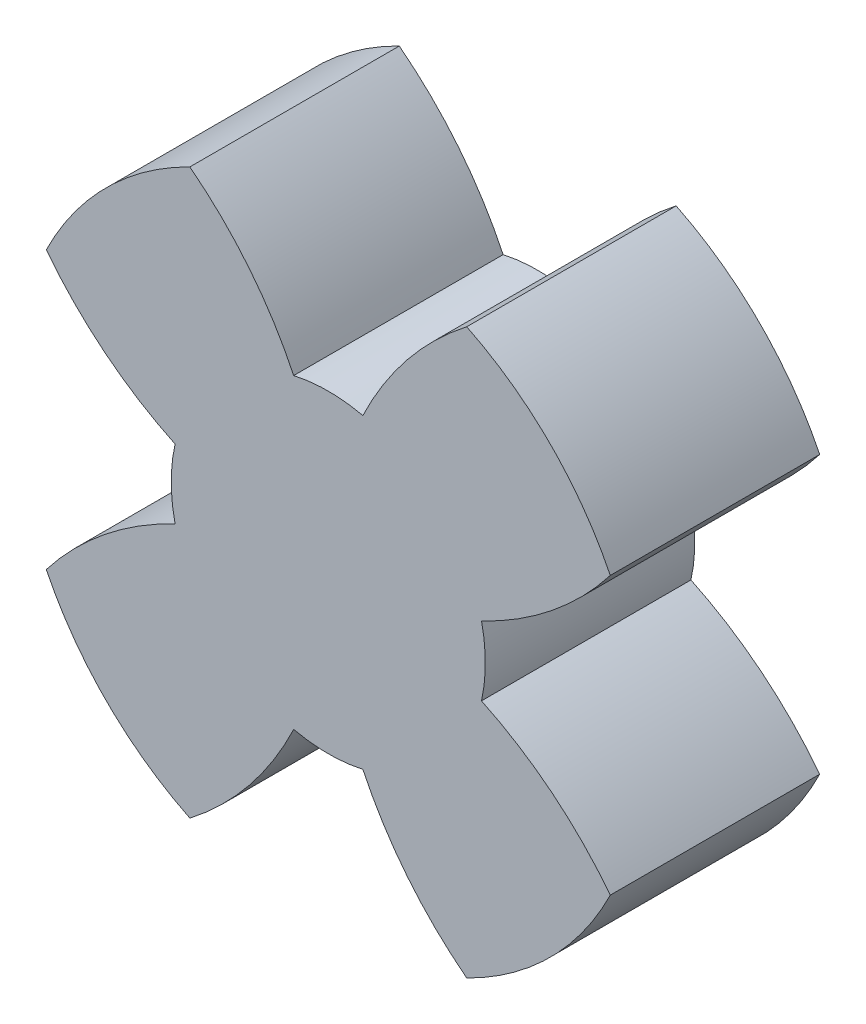
ISO-10303-21;
HEADER;
FILE_DESCRIPTION(('STEP AP214'),'2;1');
FILE_NAME('part.step','',(''),(''),'','','');
FILE_SCHEMA(('AUTOMOTIVE_DESIGN { 1 0 10303 214 1 1 1 1 }'));
ENDSEC;
DATA;
#1=APPLICATION_CONTEXT('core data for automotive mechanical design processes');
#2=APPLICATION_PROTOCOL_DEFINITION('international standard','automotive_design',2000,#1);
#3=PRODUCT_CONTEXT('',#1,'mechanical');
#4=PRODUCT('Part','Part','',(#3));
#5=PRODUCT_RELATED_PRODUCT_CATEGORY('part','',(#4));
#6=PRODUCT_DEFINITION_FORMATION('','',#4);
#7=PRODUCT_DEFINITION_CONTEXT('part definition',#1,'design');
#8=PRODUCT_DEFINITION('design','',#6,#7);
#9=PRODUCT_DEFINITION_SHAPE('','',#8);
#10=(LENGTH_UNIT() NAMED_UNIT(*) SI_UNIT(.MILLI.,.METRE.));
#11=(NAMED_UNIT(*) PLANE_ANGLE_UNIT() SI_UNIT($,.RADIAN.));
#12=(NAMED_UNIT(*) SI_UNIT($,.STERADIAN.) SOLID_ANGLE_UNIT());
#13=UNCERTAINTY_MEASURE_WITH_UNIT(LENGTH_MEASURE(1.E-05),#10,'distance_accuracy_value','');
#14=(GEOMETRIC_REPRESENTATION_CONTEXT(3) GLOBAL_UNCERTAINTY_ASSIGNED_CONTEXT((#13)) GLOBAL_UNIT_ASSIGNED_CONTEXT((#10,
#11,#12)) REPRESENTATION_CONTEXT('',''));
#15=CARTESIAN_POINT('',(0.,0.,0.));
#16=DIRECTION('',(0.,0.,1.));
#17=DIRECTION('',(1.,0.,0.));
#18=AXIS2_PLACEMENT_3D('',#15,#16,#17);
#19=CARTESIAN_POINT('',(-7.04297731246584E-12,-17.0196671709438,10.));
#20=DIRECTION('',(0.,0.,-1.));
#21=DIRECTION('',(-0.791147210042415,0.61162577777764,0.));
#22=AXIS2_PLACEMENT_3D('',#19,#20,#21);
#23=CYLINDRICAL_SURFACE('',#22,17.0196671709416);
#24=CARTESIAN_POINT('',(-7.04297731246584E-12,-17.0196671709438,0.));
#25=DIRECTION('',(0.,0.,1.));
#26=DIRECTION('',(-0.429837123316014,0.902906444444503,0.));
#27=AXIS2_PLACEMENT_3D('',#24,#25,#26);
#28=CIRCLE('',#27,17.0196671709416);
#29=CARTESIAN_POINT('',(-7.3156847765606,-1.6525,0.));
#30=VERTEX_POINT('',#29);
#31=CARTESIAN_POINT('',(-13.465062198148,-6.61,0.));
#32=VERTEX_POINT('',#31);
#33=EDGE_CURVE('E128',#30,#32,#28,.T.);
#34=ORIENTED_EDGE('',*,*,#33,.T.);
#35=DIRECTION('',(0.,0.,1.));
#36=VECTOR('',#35,1.);
#37=CARTESIAN_POINT('',(-13.465062198148,-6.61,0.));
#38=LINE('',#37,#36);
#39=CARTESIAN_POINT('',(-13.465062198148,-6.61,10.));
#40=VERTEX_POINT('',#39);
#41=EDGE_CURVE('E142',#40,#32,#38,.F.);
#42=ORIENTED_EDGE('',*,*,#41,.F.);
#43=CARTESIAN_POINT('',(-7.04297731246584E-12,-17.0196671709438,10.));
#44=DIRECTION('',(0.,0.,-1.));
#45=DIRECTION('',(-0.791147210042415,0.61162577777764,0.));
#46=AXIS2_PLACEMENT_3D('',#43,#44,#45);
#47=CIRCLE('',#46,17.0196671709416);
#48=CARTESIAN_POINT('',(-7.3156847765606,-1.6525,10.));
#49=VERTEX_POINT('',#48);
#50=EDGE_CURVE('E148',#49,#40,#47,.F.);
#51=ORIENTED_EDGE('',*,*,#50,.F.);
#52=DIRECTION('',(0.,0.,-1.));
#53=VECTOR('',#52,1.);
#54=CARTESIAN_POINT('',(-7.3156847765606,-1.6525,10.));
#55=LINE('',#54,#53);
#56=EDGE_CURVE('E136',#49,#30,#55,.T.);
#57=ORIENTED_EDGE('',*,*,#56,.T.);
#58=EDGE_LOOP('',(#34,#42,#51,#57));
#59=FACE_BOUND('',#58,.T.);
#60=ADVANCED_FACE('F16',(#59),#23,.T.);
#61=CARTESIAN_POINT('',(1.45196354939259E-12,1.45196354939259E-12,10.));
#62=DIRECTION('',(0.,0.,-1.));
#63=DIRECTION('',(-0.440666666666711,-0.897670813209859,0.));
#64=AXIS2_PLACEMENT_3D('',#61,#62,#63);
#65=CYLINDRICAL_SURFACE('',#64,15.0000000000017);
#66=CARTESIAN_POINT('',(1.45196354939259E-12,1.45196354939259E-12,0.));
#67=DIRECTION('',(0.,0.,1.));
#68=DIRECTION('',(-0.897670813209859,-0.440666666666712,0.));
#69=AXIS2_PLACEMENT_3D('',#66,#67,#68);
#70=CIRCLE('',#69,15.0000000000017);
#71=CARTESIAN_POINT('',(-6.61,-13.465062198148,0.));
#72=VERTEX_POINT('',#71);
#73=EDGE_CURVE('E126',#32,#72,#70,.T.);
#74=ORIENTED_EDGE('',*,*,#73,.T.);
#75=DIRECTION('',(0.,0.,1.));
#76=VECTOR('',#75,1.);
#77=CARTESIAN_POINT('',(-6.61,-13.465062198148,0.));
#78=LINE('',#77,#76);
#79=CARTESIAN_POINT('',(-6.60999999999999,-13.465062198148,10.));
#80=VERTEX_POINT('',#79);
#81=EDGE_CURVE('E135',#80,#72,#78,.F.);
#82=ORIENTED_EDGE('',*,*,#81,.F.);
#83=CARTESIAN_POINT('',(1.45196354939259E-12,1.45196354939259E-12,10.));
#84=DIRECTION('',(0.,0.,-1.));
#85=DIRECTION('',(-0.440666666666711,-0.897670813209859,0.));
#86=AXIS2_PLACEMENT_3D('',#83,#84,#85);
#87=CIRCLE('',#86,15.0000000000017);
#88=EDGE_CURVE('E147',#40,#80,#87,.F.);
#89=ORIENTED_EDGE('',*,*,#88,.F.);
#90=ORIENTED_EDGE('',*,*,#41,.T.);
#91=EDGE_LOOP('',(#74,#82,#89,#90));
#92=FACE_BOUND('',#91,.T.);
#93=ADVANCED_FACE('F146',(#92),#65,.T.);
#94=CARTESIAN_POINT('',(-17.0196671709438,-7.04297731246584E-12,10.));
#95=DIRECTION('',(0.,0.,-1.));
#96=DIRECTION('',(0.902906444444503,-0.429837123316014,0.));
#97=AXIS2_PLACEMENT_3D('',#94,#95,#96);
#98=CYLINDRICAL_SURFACE('',#97,17.0196671709416);
#99=CARTESIAN_POINT('',(-17.0196671709438,-7.04297731246584E-12,0.));
#100=DIRECTION('',(0.,0.,1.));
#101=DIRECTION('',(0.61162577777764,-0.791147210042415,0.));
#102=AXIS2_PLACEMENT_3D('',#99,#100,#101);
#103=CIRCLE('',#102,17.0196671709416);
#104=CARTESIAN_POINT('',(-1.6525,-7.31568477656061,0.));
#105=VERTEX_POINT('',#104);
#106=EDGE_CURVE('E130',#72,#105,#103,.T.);
#107=ORIENTED_EDGE('',*,*,#106,.T.);
#108=DIRECTION('',(0.,0.,1.));
#109=VECTOR('',#108,1.);
#110=CARTESIAN_POINT('',(-1.6525,-7.31568477656061,0.));
#111=LINE('',#110,#109);
#112=CARTESIAN_POINT('',(-1.6525,-7.31568477656061,10.));
#113=VERTEX_POINT('',#112);
#114=EDGE_CURVE('E170',#113,#105,#111,.F.);
#115=ORIENTED_EDGE('',*,*,#114,.F.);
#116=CARTESIAN_POINT('',(-17.0196671709438,-7.04297731246584E-12,10.));
#117=DIRECTION('',(0.,0.,-1.));
#118=DIRECTION('',(0.902906444444503,-0.429837123316014,0.));
#119=AXIS2_PLACEMENT_3D('',#116,#117,#118);
#120=CIRCLE('',#119,17.0196671709416);
#121=EDGE_CURVE('E175',#80,#113,#120,.F.);
#122=ORIENTED_EDGE('',*,*,#121,.F.);
#123=ORIENTED_EDGE('',*,*,#81,.T.);
#124=EDGE_LOOP('',(#107,#115,#122,#123));
#125=FACE_BOUND('',#124,.T.);
#126=ADVANCED_FACE('F401',(#125),#98,.T.);
#127=CARTESIAN_POINT('',(0.,1.40859546249317E-12,10.));
#128=DIRECTION('',(0.,0.,-1.));
#129=DIRECTION('',(0.220333333333292,-0.975424636874751,0.));
#130=AXIS2_PLACEMENT_3D('',#127,#128,#129);
#131=CYLINDRICAL_SURFACE('',#130,7.50000000000141);
#132=CARTESIAN_POINT('',(0.,1.40859546249317E-12,0.));
#133=DIRECTION('',(0.,0.,1.));
#134=DIRECTION('',(-0.220333333333292,-0.975424636874751,0.));
#135=AXIS2_PLACEMENT_3D('',#132,#133,#134);
#136=CIRCLE('',#135,7.50000000000141);
#137=CARTESIAN_POINT('',(1.6525,-7.3156847765606,0.));
#138=VERTEX_POINT('',#137);
#139=EDGE_CURVE('E179',#105,#138,#136,.T.);
#140=ORIENTED_EDGE('',*,*,#139,.T.);
#141=DIRECTION('',(0.,0.,1.));
#142=VECTOR('',#141,1.);
#143=CARTESIAN_POINT('',(1.6525,-7.3156847765606,0.));
#144=LINE('',#143,#142);
#145=CARTESIAN_POINT('',(1.6525,-7.3156847765606,10.));
#146=VERTEX_POINT('',#145);
#147=EDGE_CURVE('E184',#146,#138,#144,.F.);
#148=ORIENTED_EDGE('',*,*,#147,.F.);
#149=CARTESIAN_POINT('',(0.,1.40859546249317E-12,10.));
#150=DIRECTION('',(0.,0.,-1.));
#151=DIRECTION('',(0.220333333333292,-0.975424636874751,0.));
#152=AXIS2_PLACEMENT_3D('',#149,#150,#151);
#153=CIRCLE('',#152,7.50000000000141);
#154=EDGE_CURVE('E189',#113,#146,#153,.F.);
#155=ORIENTED_EDGE('',*,*,#154,.F.);
#156=ORIENTED_EDGE('',*,*,#114,.T.);
#157=EDGE_LOOP('',(#140,#148,#155,#156));
#158=FACE_BOUND('',#157,.T.);
#159=ADVANCED_FACE('F396',(#158),#131,.T.);
#160=CARTESIAN_POINT('',(17.0196671709438,-7.04297731246584E-12,10.));
#161=DIRECTION('',(0.,0.,-1.));
#162=DIRECTION('',(-0.61162577777764,-0.791147210042415,0.));
#163=AXIS2_PLACEMENT_3D('',#160,#161,#162);
#164=CYLINDRICAL_SURFACE('',#163,17.0196671709416);
#165=CARTESIAN_POINT('',(17.0196671709438,-7.04297731246584E-12,0.));
#166=DIRECTION('',(0.,0.,1.));
#167=DIRECTION('',(-0.902906444444503,-0.429837123316014,0.));
#168=AXIS2_PLACEMENT_3D('',#165,#166,#167);
#169=CIRCLE('',#168,17.0196671709416);
#170=CARTESIAN_POINT('',(6.60999999999999,-13.465062198148,0.));
#171=VERTEX_POINT('',#170);
#172=EDGE_CURVE('E193',#138,#171,#169,.T.);
#173=ORIENTED_EDGE('',*,*,#172,.T.);
#174=DIRECTION('',(0.,0.,1.));
#175=VECTOR('',#174,1.);
#176=CARTESIAN_POINT('',(6.60999999999999,-13.465062198148,0.));
#177=LINE('',#176,#175);
#178=CARTESIAN_POINT('',(6.60999999999999,-13.465062198148,10.));
#179=VERTEX_POINT('',#178);
#180=EDGE_CURVE('E198',#179,#171,#177,.F.);
#181=ORIENTED_EDGE('',*,*,#180,.F.);
#182=CARTESIAN_POINT('',(17.0196671709438,-7.04297731246584E-12,10.));
#183=DIRECTION('',(0.,0.,-1.));
#184=DIRECTION('',(-0.61162577777764,-0.791147210042415,0.));
#185=AXIS2_PLACEMENT_3D('',#182,#183,#184);
#186=CIRCLE('',#185,17.0196671709416);
#187=EDGE_CURVE('E203',#146,#179,#186,.F.);
#188=ORIENTED_EDGE('',*,*,#187,.F.);
#189=ORIENTED_EDGE('',*,*,#147,.T.);
#190=EDGE_LOOP('',(#173,#181,#188,#189));
#191=FACE_BOUND('',#190,.T.);
#192=ADVANCED_FACE('F393',(#191),#164,.T.);
#193=CARTESIAN_POINT('',(-1.45196354939259E-12,1.45196354939259E-12,10.));
#194=DIRECTION('',(0.,0.,-1.));
#195=DIRECTION('',(0.897670813209859,-0.440666666666711,0.));
#196=AXIS2_PLACEMENT_3D('',#193,#194,#195);
#197=CYLINDRICAL_SURFACE('',#196,15.0000000000017);
#198=CARTESIAN_POINT('',(-1.45196354939259E-12,1.45196354939259E-12,0.));
#199=DIRECTION('',(0.,0.,1.));
#200=DIRECTION('',(0.440666666666712,-0.897670813209859,0.));
#201=AXIS2_PLACEMENT_3D('',#198,#199,#200);
#202=CIRCLE('',#201,15.0000000000017);
#203=CARTESIAN_POINT('',(13.465062198148,-6.61,0.));
#204=VERTEX_POINT('',#203);
#205=EDGE_CURVE('E207',#171,#204,#202,.T.);
#206=ORIENTED_EDGE('',*,*,#205,.T.);
#207=DIRECTION('',(0.,0.,1.));
#208=VECTOR('',#207,1.);
#209=CARTESIAN_POINT('',(13.465062198148,-6.61,0.));
#210=LINE('',#209,#208);
#211=CARTESIAN_POINT('',(13.465062198148,-6.60999999999999,10.));
#212=VERTEX_POINT('',#211);
#213=EDGE_CURVE('E212',#212,#204,#210,.F.);
#214=ORIENTED_EDGE('',*,*,#213,.F.);
#215=CARTESIAN_POINT('',(-1.45196354939259E-12,1.45196354939259E-12,10.));
#216=DIRECTION('',(0.,0.,-1.));
#217=DIRECTION('',(0.897670813209859,-0.440666666666711,0.));
#218=AXIS2_PLACEMENT_3D('',#215,#216,#217);
#219=CIRCLE('',#218,15.0000000000017);
#220=EDGE_CURVE('E217',#179,#212,#219,.F.);
#221=ORIENTED_EDGE('',*,*,#220,.F.);
#222=ORIENTED_EDGE('',*,*,#180,.T.);
#223=EDGE_LOOP('',(#206,#214,#221,#222));
#224=FACE_BOUND('',#223,.T.);
#225=ADVANCED_FACE('F388',(#224),#197,.T.);
#226=CARTESIAN_POINT('',(7.04297731246584E-12,-17.0196671709438,10.));
#227=DIRECTION('',(0.,0.,-1.));
#228=DIRECTION('',(0.429837123316013,0.902906444444503,0.));
#229=AXIS2_PLACEMENT_3D('',#226,#227,#228);
#230=CYLINDRICAL_SURFACE('',#229,17.0196671709416);
#231=CARTESIAN_POINT('',(7.04297731246584E-12,-17.0196671709438,0.));
#232=DIRECTION('',(0.,0.,1.));
#233=DIRECTION('',(0.791147210042415,0.61162577777764,0.));
#234=AXIS2_PLACEMENT_3D('',#231,#232,#233);
#235=CIRCLE('',#234,17.0196671709416);
#236=CARTESIAN_POINT('',(7.31568477656059,-1.65249999999999,0.));
#237=VERTEX_POINT('',#236);
#238=EDGE_CURVE('E221',#204,#237,#235,.T.);
#239=ORIENTED_EDGE('',*,*,#238,.T.);
#240=DIRECTION('',(0.,0.,1.));
#241=VECTOR('',#240,1.);
#242=CARTESIAN_POINT('',(7.31568477656059,-1.65249999999999,0.));
#243=LINE('',#242,#241);
#244=CARTESIAN_POINT('',(7.31568477656059,-1.65249999999999,10.));
#245=VERTEX_POINT('',#244);
#246=EDGE_CURVE('E226',#245,#237,#243,.F.);
#247=ORIENTED_EDGE('',*,*,#246,.F.);
#248=CARTESIAN_POINT('',(7.04297731246584E-12,-17.0196671709438,10.));
#249=DIRECTION('',(0.,0.,-1.));
#250=DIRECTION('',(0.429837123316013,0.902906444444503,0.));
#251=AXIS2_PLACEMENT_3D('',#248,#249,#250);
#252=CIRCLE('',#251,17.0196671709416);
#253=EDGE_CURVE('E231',#212,#245,#252,.F.);
#254=ORIENTED_EDGE('',*,*,#253,.F.);
#255=ORIENTED_EDGE('',*,*,#213,.T.);
#256=EDGE_LOOP('',(#239,#247,#254,#255));
#257=FACE_BOUND('',#256,.T.);
#258=ADVANCED_FACE('F385',(#257),#230,.T.);
#259=CARTESIAN_POINT('',(-1.40859546249317E-12,0.,10.));
#260=DIRECTION('',(0.,0.,-1.));
#261=DIRECTION('',(0.975424636874751,0.220333333333292,0.));
#262=AXIS2_PLACEMENT_3D('',#259,#260,#261);
#263=CYLINDRICAL_SURFACE('',#262,7.50000000000141);
#264=CARTESIAN_POINT('',(-1.40859546249317E-12,0.,0.));
#265=DIRECTION('',(0.,0.,1.));
#266=DIRECTION('',(0.975424636874752,-0.220333333333291,0.));
#267=AXIS2_PLACEMENT_3D('',#264,#265,#266);
#268=CIRCLE('',#267,7.50000000000141);
#269=CARTESIAN_POINT('',(7.3156847765606,1.6525,0.));
#270=VERTEX_POINT('',#269);
#271=EDGE_CURVE('E235',#237,#270,#268,.T.);
#272=ORIENTED_EDGE('',*,*,#271,.T.);
#273=DIRECTION('',(0.,0.,1.));
#274=VECTOR('',#273,1.);
#275=CARTESIAN_POINT('',(7.3156847765606,1.6525,0.));
#276=LINE('',#275,#274);
#277=CARTESIAN_POINT('',(7.3156847765606,1.6525,10.));
#278=VERTEX_POINT('',#277);
#279=EDGE_CURVE('E240',#278,#270,#276,.F.);
#280=ORIENTED_EDGE('',*,*,#279,.F.);
#281=CARTESIAN_POINT('',(-1.40859546249317E-12,0.,10.));
#282=DIRECTION('',(0.,0.,-1.));
#283=DIRECTION('',(0.975424636874751,0.220333333333292,0.));
#284=AXIS2_PLACEMENT_3D('',#281,#282,#283);
#285=CIRCLE('',#284,7.50000000000141);
#286=EDGE_CURVE('E245',#245,#278,#285,.F.);
#287=ORIENTED_EDGE('',*,*,#286,.F.);
#288=ORIENTED_EDGE('',*,*,#246,.T.);
#289=EDGE_LOOP('',(#272,#280,#287,#288));
#290=FACE_BOUND('',#289,.T.);
#291=ADVANCED_FACE('F380',(#290),#263,.T.);
#292=CARTESIAN_POINT('',(7.04297731246584E-12,17.0196671709438,10.));
#293=DIRECTION('',(0.,0.,-1.));
#294=DIRECTION('',(0.791147210042415,-0.61162577777764,0.));
#295=AXIS2_PLACEMENT_3D('',#292,#293,#294);
#296=CYLINDRICAL_SURFACE('',#295,17.0196671709416);
#297=CARTESIAN_POINT('',(7.04297731246584E-12,17.0196671709438,0.));
#298=DIRECTION('',(0.,0.,1.));
#299=DIRECTION('',(0.429837123316014,-0.902906444444503,0.));
#300=AXIS2_PLACEMENT_3D('',#297,#298,#299);
#301=CIRCLE('',#300,17.0196671709416);
#302=CARTESIAN_POINT('',(13.465062198148,6.60999999999999,0.));
#303=VERTEX_POINT('',#302);
#304=EDGE_CURVE('E249',#270,#303,#301,.T.);
#305=ORIENTED_EDGE('',*,*,#304,.T.);
#306=DIRECTION('',(0.,0.,1.));
#307=VECTOR('',#306,1.);
#308=CARTESIAN_POINT('',(13.465062198148,6.60999999999999,0.));
#309=LINE('',#308,#307);
#310=CARTESIAN_POINT('',(13.465062198148,6.60999999999999,10.));
#311=VERTEX_POINT('',#310);
#312=EDGE_CURVE('E254',#311,#303,#309,.F.);
#313=ORIENTED_EDGE('',*,*,#312,.F.);
#314=CARTESIAN_POINT('',(7.04297731246584E-12,17.0196671709438,10.));
#315=DIRECTION('',(0.,0.,-1.));
#316=DIRECTION('',(0.791147210042415,-0.61162577777764,0.));
#317=AXIS2_PLACEMENT_3D('',#314,#315,#316);
#318=CIRCLE('',#317,17.0196671709416);
#319=EDGE_CURVE('E259',#278,#311,#318,.F.);
#320=ORIENTED_EDGE('',*,*,#319,.F.);
#321=ORIENTED_EDGE('',*,*,#279,.T.);
#322=EDGE_LOOP('',(#305,#313,#320,#321));
#323=FACE_BOUND('',#322,.T.);
#324=ADVANCED_FACE('F377',(#323),#296,.T.);
#325=CARTESIAN_POINT('',(-1.45196354939259E-12,-1.45196354939259E-12,10.));
#326=DIRECTION('',(0.,0.,-1.));
#327=DIRECTION('',(0.440666666666712,0.897670813209859,0.));
#328=AXIS2_PLACEMENT_3D('',#325,#326,#327);
#329=CYLINDRICAL_SURFACE('',#328,15.0000000000017);
#330=CARTESIAN_POINT('',(-1.45196354939259E-12,-1.45196354939259E-12,0.));
#331=DIRECTION('',(0.,0.,1.));
#332=DIRECTION('',(0.897670813209859,0.440666666666712,0.));
#333=AXIS2_PLACEMENT_3D('',#330,#331,#332);
#334=CIRCLE('',#333,15.0000000000017);
#335=CARTESIAN_POINT('',(6.61,13.465062198148,0.));
#336=VERTEX_POINT('',#335);
#337=EDGE_CURVE('E263',#303,#336,#334,.T.);
#338=ORIENTED_EDGE('',*,*,#337,.T.);
#339=DIRECTION('',(0.,0.,1.));
#340=VECTOR('',#339,1.);
#341=CARTESIAN_POINT('',(6.61,13.465062198148,0.));
#342=LINE('',#341,#340);
#343=CARTESIAN_POINT('',(6.61,13.465062198148,10.));
#344=VERTEX_POINT('',#343);
#345=EDGE_CURVE('E268',#344,#336,#342,.F.);
#346=ORIENTED_EDGE('',*,*,#345,.F.);
#347=CARTESIAN_POINT('',(-1.45196354939259E-12,-1.45196354939259E-12,10.));
#348=DIRECTION('',(0.,0.,-1.));
#349=DIRECTION('',(0.440666666666712,0.897670813209859,0.));
#350=AXIS2_PLACEMENT_3D('',#347,#348,#349);
#351=CIRCLE('',#350,15.0000000000017);
#352=EDGE_CURVE('E273',#311,#344,#351,.F.);
#353=ORIENTED_EDGE('',*,*,#352,.F.);
#354=ORIENTED_EDGE('',*,*,#312,.T.);
#355=EDGE_LOOP('',(#338,#346,#353,#354));
#356=FACE_BOUND('',#355,.T.);
#357=ADVANCED_FACE('F372',(#356),#329,.T.);
#358=CARTESIAN_POINT('',(17.0196671709438,7.04297731246584E-12,10.));
#359=DIRECTION('',(0.,0.,-1.));
#360=DIRECTION('',(-0.902906444444503,0.429837123316014,0.));
#361=AXIS2_PLACEMENT_3D('',#358,#359,#360);
#362=CYLINDRICAL_SURFACE('',#361,17.0196671709416);
#363=CARTESIAN_POINT('',(17.0196671709438,7.04297731246584E-12,0.));
#364=DIRECTION('',(0.,0.,1.));
#365=DIRECTION('',(-0.61162577777764,0.791147210042415,0.));
#366=AXIS2_PLACEMENT_3D('',#363,#364,#365);
#367=CIRCLE('',#366,17.0196671709416);
#368=CARTESIAN_POINT('',(1.6525,7.31568477656061,0.));
#369=VERTEX_POINT('',#368);
#370=EDGE_CURVE('E277',#336,#369,#367,.T.);
#371=ORIENTED_EDGE('',*,*,#370,.T.);
#372=DIRECTION('',(0.,0.,1.));
#373=VECTOR('',#372,1.);
#374=CARTESIAN_POINT('',(1.6525,7.3156847765606,0.));
#375=LINE('',#374,#373);
#376=CARTESIAN_POINT('',(1.6525,7.3156847765606,10.));
#377=VERTEX_POINT('',#376);
#378=EDGE_CURVE('E282',#377,#369,#375,.F.);
#379=ORIENTED_EDGE('',*,*,#378,.F.);
#380=CARTESIAN_POINT('',(17.0196671709438,7.04297731246584E-12,10.));
#381=DIRECTION('',(0.,0.,-1.));
#382=DIRECTION('',(-0.902906444444503,0.429837123316014,0.));
#383=AXIS2_PLACEMENT_3D('',#380,#381,#382);
#384=CIRCLE('',#383,17.0196671709416);
#385=EDGE_CURVE('E287',#344,#377,#384,.F.);
#386=ORIENTED_EDGE('',*,*,#385,.F.);
#387=ORIENTED_EDGE('',*,*,#345,.T.);
#388=EDGE_LOOP('',(#371,#379,#386,#387));
#389=FACE_BOUND('',#388,.T.);
#390=ADVANCED_FACE('F369',(#389),#362,.T.);
#391=CARTESIAN_POINT('',(0.,-1.40512601554121E-12,10.));
#392=DIRECTION('',(0.,0.,-1.));
#393=DIRECTION('',(-0.220333333333292,0.975424636874751,0.));
#394=AXIS2_PLACEMENT_3D('',#391,#392,#393);
#395=CYLINDRICAL_SURFACE('',#394,7.50000000000141);
#396=CARTESIAN_POINT('',(0.,-1.40512601554121E-12,0.));
#397=DIRECTION('',(0.,0.,1.));
#398=DIRECTION('',(0.220333333333292,0.975424636874751,0.));
#399=AXIS2_PLACEMENT_3D('',#396,#397,#398);
#400=CIRCLE('',#399,7.50000000000141);
#401=CARTESIAN_POINT('',(-1.6525,7.31568477656061,0.));
#402=VERTEX_POINT('',#401);
#403=EDGE_CURVE('E291',#369,#402,#400,.T.);
#404=ORIENTED_EDGE('',*,*,#403,.T.);
#405=DIRECTION('',(0.,0.,1.));
#406=VECTOR('',#405,1.);
#407=CARTESIAN_POINT('',(-1.6525,7.31568477656061,0.));
#408=LINE('',#407,#406);
#409=CARTESIAN_POINT('',(-1.6525,7.31568477656061,10.));
#410=VERTEX_POINT('',#409);
#411=EDGE_CURVE('E296',#410,#402,#408,.F.);
#412=ORIENTED_EDGE('',*,*,#411,.F.);
#413=CARTESIAN_POINT('',(0.,-1.40512601554121E-12,10.));
#414=DIRECTION('',(0.,0.,-1.));
#415=DIRECTION('',(-0.220333333333292,0.975424636874751,0.));
#416=AXIS2_PLACEMENT_3D('',#413,#414,#415);
#417=CIRCLE('',#416,7.50000000000141);
#418=EDGE_CURVE('E301',#377,#410,#417,.F.);
#419=ORIENTED_EDGE('',*,*,#418,.F.);
#420=ORIENTED_EDGE('',*,*,#378,.T.);
#421=EDGE_LOOP('',(#404,#412,#419,#420));
#422=FACE_BOUND('',#421,.T.);
#423=ADVANCED_FACE('F364',(#422),#395,.T.);
#424=CARTESIAN_POINT('',(-17.0196671709438,7.04297731246584E-12,10.));
#425=DIRECTION('',(0.,0.,-1.));
#426=DIRECTION('',(0.611625777777641,0.791147210042414,0.));
#427=AXIS2_PLACEMENT_3D('',#424,#425,#426);
#428=CYLINDRICAL_SURFACE('',#427,17.0196671709416);
#429=CARTESIAN_POINT('',(-17.0196671709438,7.04297731246584E-12,0.));
#430=DIRECTION('',(0.,0.,1.));
#431=DIRECTION('',(0.902906444444503,0.429837123316014,0.));
#432=AXIS2_PLACEMENT_3D('',#429,#430,#431);
#433=CIRCLE('',#432,17.0196671709416);
#434=CARTESIAN_POINT('',(-6.61,13.465062198148,0.));
#435=VERTEX_POINT('',#434);
#436=EDGE_CURVE('E305',#402,#435,#433,.T.);
#437=ORIENTED_EDGE('',*,*,#436,.T.);
#438=DIRECTION('',(0.,0.,1.));
#439=VECTOR('',#438,1.);
#440=CARTESIAN_POINT('',(-6.61,13.465062198148,0.));
#441=LINE('',#440,#439);
#442=CARTESIAN_POINT('',(-6.60999999999999,13.465062198148,10.));
#443=VERTEX_POINT('',#442);
#444=EDGE_CURVE('E310',#443,#435,#441,.F.);
#445=ORIENTED_EDGE('',*,*,#444,.F.);
#446=CARTESIAN_POINT('',(-17.0196671709438,7.04297731246584E-12,10.));
#447=DIRECTION('',(0.,0.,-1.));
#448=DIRECTION('',(0.611625777777641,0.791147210042414,0.));
#449=AXIS2_PLACEMENT_3D('',#446,#447,#448);
#450=CIRCLE('',#449,17.0196671709416);
#451=EDGE_CURVE('E315',#410,#443,#450,.F.);
#452=ORIENTED_EDGE('',*,*,#451,.F.);
#453=ORIENTED_EDGE('',*,*,#411,.T.);
#454=EDGE_LOOP('',(#437,#445,#452,#453));
#455=FACE_BOUND('',#454,.T.);
#456=ADVANCED_FACE('F361',(#455),#428,.T.);
#457=CARTESIAN_POINT('',(1.45196354939259E-12,-1.45196354939259E-12,10.));
#458=DIRECTION('',(0.,0.,-1.));
#459=DIRECTION('',(-0.897670813209859,0.440666666666712,0.));
#460=AXIS2_PLACEMENT_3D('',#457,#458,#459);
#461=CYLINDRICAL_SURFACE('',#460,15.0000000000017);
#462=CARTESIAN_POINT('',(1.45196354939259E-12,-1.45196354939259E-12,0.));
#463=DIRECTION('',(0.,0.,1.));
#464=DIRECTION('',(-0.440666666666712,0.897670813209859,0.));
#465=AXIS2_PLACEMENT_3D('',#462,#463,#464);
#466=CIRCLE('',#465,15.0000000000017);
#467=CARTESIAN_POINT('',(-13.465062198148,6.61,0.));
#468=VERTEX_POINT('',#467);
#469=EDGE_CURVE('E319',#435,#468,#466,.T.);
#470=ORIENTED_EDGE('',*,*,#469,.T.);
#471=DIRECTION('',(0.,0.,1.));
#472=VECTOR('',#471,1.);
#473=CARTESIAN_POINT('',(-13.465062198148,6.61,0.));
#474=LINE('',#473,#472);
#475=CARTESIAN_POINT('',(-13.465062198148,6.61,10.));
#476=VERTEX_POINT('',#475);
#477=EDGE_CURVE('E324',#476,#468,#474,.F.);
#478=ORIENTED_EDGE('',*,*,#477,.F.);
#479=CARTESIAN_POINT('',(1.45196354939259E-12,-1.45196354939259E-12,10.));
#480=DIRECTION('',(0.,0.,-1.));
#481=DIRECTION('',(-0.897670813209859,0.440666666666712,0.));
#482=AXIS2_PLACEMENT_3D('',#479,#480,#481);
#483=CIRCLE('',#482,15.0000000000017);
#484=EDGE_CURVE('E329',#443,#476,#483,.F.);
#485=ORIENTED_EDGE('',*,*,#484,.F.);
#486=ORIENTED_EDGE('',*,*,#444,.T.);
#487=EDGE_LOOP('',(#470,#478,#485,#486));
#488=FACE_BOUND('',#487,.T.);
#489=ADVANCED_FACE('F356',(#488),#461,.T.);
#490=CARTESIAN_POINT('',(-7.04297731246584E-12,17.0196671709438,10.));
#491=DIRECTION('',(0.,0.,-1.));
#492=DIRECTION('',(-0.429837123316014,-0.902906444444503,0.));
#493=AXIS2_PLACEMENT_3D('',#490,#491,#492);
#494=CYLINDRICAL_SURFACE('',#493,17.0196671709416);
#495=CARTESIAN_POINT('',(-7.04297731246584E-12,17.0196671709438,0.));
#496=DIRECTION('',(0.,0.,1.));
#497=DIRECTION('',(-0.791147210042415,-0.61162577777764,0.));
#498=AXIS2_PLACEMENT_3D('',#495,#496,#497);
#499=CIRCLE('',#498,17.0196671709416);
#500=CARTESIAN_POINT('',(-7.3156847765606,1.6525,0.));
#501=VERTEX_POINT('',#500);
#502=EDGE_CURVE('E333',#468,#501,#499,.T.);
#503=ORIENTED_EDGE('',*,*,#502,.T.);
#504=DIRECTION('',(0.,0.,1.));
#505=VECTOR('',#504,1.);
#506=CARTESIAN_POINT('',(-7.3156847765606,1.6525,0.));
#507=LINE('',#506,#505);
#508=CARTESIAN_POINT('',(-7.3156847765606,1.6525,10.));
#509=VERTEX_POINT('',#508);
#510=EDGE_CURVE('E337',#509,#501,#507,.F.);
#511=ORIENTED_EDGE('',*,*,#510,.F.);
#512=CARTESIAN_POINT('',(-7.04297731246584E-12,17.0196671709438,10.));
#513=DIRECTION('',(0.,0.,-1.));
#514=DIRECTION('',(-0.429837123316014,-0.902906444444503,0.));
#515=AXIS2_PLACEMENT_3D('',#512,#513,#514);
#516=CIRCLE('',#515,17.0196671709416);
#517=EDGE_CURVE('E31',#476,#509,#516,.F.);
#518=ORIENTED_EDGE('',*,*,#517,.F.);
#519=ORIENTED_EDGE('',*,*,#477,.T.);
#520=EDGE_LOOP('',(#503,#511,#518,#519));
#521=FACE_BOUND('',#520,.T.);
#522=ADVANCED_FACE('F353',(#521),#494,.T.);
#523=CARTESIAN_POINT('',(1.40772810075518E-12,0.,10.));
#524=DIRECTION('',(0.,0.,-1.));
#525=DIRECTION('',(-0.975424636874751,-0.220333333333292,0.));
#526=AXIS2_PLACEMENT_3D('',#523,#524,#525);
#527=CYLINDRICAL_SURFACE('',#526,7.50000000000141);
#528=CARTESIAN_POINT('',(1.40772810075518E-12,0.,0.));
#529=DIRECTION('',(0.,0.,1.));
#530=DIRECTION('',(-0.975424636874751,0.220333333333292,0.));
#531=AXIS2_PLACEMENT_3D('',#528,#529,#530);
#532=CIRCLE('',#531,7.50000000000141);
#533=EDGE_CURVE('E25',#501,#30,#532,.T.);
#534=ORIENTED_EDGE('',*,*,#533,.T.);
#535=ORIENTED_EDGE('',*,*,#56,.F.);
#536=CARTESIAN_POINT('',(1.40772810075518E-12,0.,10.));
#537=DIRECTION('',(0.,0.,-1.));
#538=DIRECTION('',(-0.975424636874751,-0.220333333333292,0.));
#539=AXIS2_PLACEMENT_3D('',#536,#537,#538);
#540=CIRCLE('',#539,7.50000000000141);
#541=EDGE_CURVE('E11',#509,#49,#540,.F.);
#542=ORIENTED_EDGE('',*,*,#541,.F.);
#543=ORIENTED_EDGE('',*,*,#510,.T.);
#544=EDGE_LOOP('',(#534,#535,#542,#543));
#545=FACE_BOUND('',#544,.T.);
#546=ADVANCED_FACE('F350',(#545),#527,.T.);
#547=CARTESIAN_POINT('',(-13.465062198148,-13.465062198148,10.));
#548=DIRECTION('',(0.,0.,1.));
#549=DIRECTION('',(1.,0.,0.));
#550=AXIS2_PLACEMENT_3D('',#547,#548,#549);
#551=PLANE('',#550);
#552=ORIENTED_EDGE('',*,*,#50,.T.);
#553=ORIENTED_EDGE('',*,*,#88,.T.);
#554=ORIENTED_EDGE('',*,*,#121,.T.);
#555=ORIENTED_EDGE('',*,*,#154,.T.);
#556=ORIENTED_EDGE('',*,*,#187,.T.);
#557=ORIENTED_EDGE('',*,*,#220,.T.);
#558=ORIENTED_EDGE('',*,*,#253,.T.);
#559=ORIENTED_EDGE('',*,*,#286,.T.);
#560=ORIENTED_EDGE('',*,*,#319,.T.);
#561=ORIENTED_EDGE('',*,*,#352,.T.);
#562=ORIENTED_EDGE('',*,*,#385,.T.);
#563=ORIENTED_EDGE('',*,*,#418,.T.);
#564=ORIENTED_EDGE('',*,*,#451,.T.);
#565=ORIENTED_EDGE('',*,*,#484,.T.);
#566=ORIENTED_EDGE('',*,*,#517,.T.);
#567=ORIENTED_EDGE('',*,*,#541,.T.);
#568=EDGE_LOOP('',(#552,#553,#554,#555,#556,#557,#558,#559,#560,#561,#562,#563,#564,#565,#566,#567));
#569=FACE_BOUND('',#568,.T.);
#570=ADVANCED_FACE('F402',(#569),#551,.T.);
#571=CARTESIAN_POINT('',(-13.465062198148,-13.465062198148,0.));
#572=DIRECTION('',(0.,0.,-1.));
#573=DIRECTION('',(0.,1.,0.));
#574=AXIS2_PLACEMENT_3D('',#571,#572,#573);
#575=PLANE('',#574);
#576=ORIENTED_EDGE('',*,*,#33,.F.);
#577=ORIENTED_EDGE('',*,*,#533,.F.);
#578=ORIENTED_EDGE('',*,*,#502,.F.);
#579=ORIENTED_EDGE('',*,*,#469,.F.);
#580=ORIENTED_EDGE('',*,*,#436,.F.);
#581=ORIENTED_EDGE('',*,*,#403,.F.);
#582=ORIENTED_EDGE('',*,*,#370,.F.);
#583=ORIENTED_EDGE('',*,*,#337,.F.);
#584=ORIENTED_EDGE('',*,*,#304,.F.);
#585=ORIENTED_EDGE('',*,*,#271,.F.);
#586=ORIENTED_EDGE('',*,*,#238,.F.);
#587=ORIENTED_EDGE('',*,*,#205,.F.);
#588=ORIENTED_EDGE('',*,*,#172,.F.);
#589=ORIENTED_EDGE('',*,*,#139,.F.);
#590=ORIENTED_EDGE('',*,*,#106,.F.);
#591=ORIENTED_EDGE('',*,*,#73,.F.);
#592=EDGE_LOOP('',(#576,#577,#578,#579,#580,#581,#582,#583,#584,#585,#586,#587,#588,#589,#590,#591));
#593=FACE_BOUND('',#592,.T.);
#594=ADVANCED_FACE('F18',(#593),#575,.T.);
#595=CLOSED_SHELL('',(#60,#93,#126,#159,#192,#225,#258,#291,#324,#357,#390,#423,#456,#489,#522,
#546,#570,#594));
#596=MANIFOLD_SOLID_BREP('B1',#595);
#597=ADVANCED_BREP_SHAPE_REPRESENTATION('',(#18,#596),#14);
#598=SHAPE_DEFINITION_REPRESENTATION(#9,#597);
ENDSEC;
END-ISO-10303-21;
